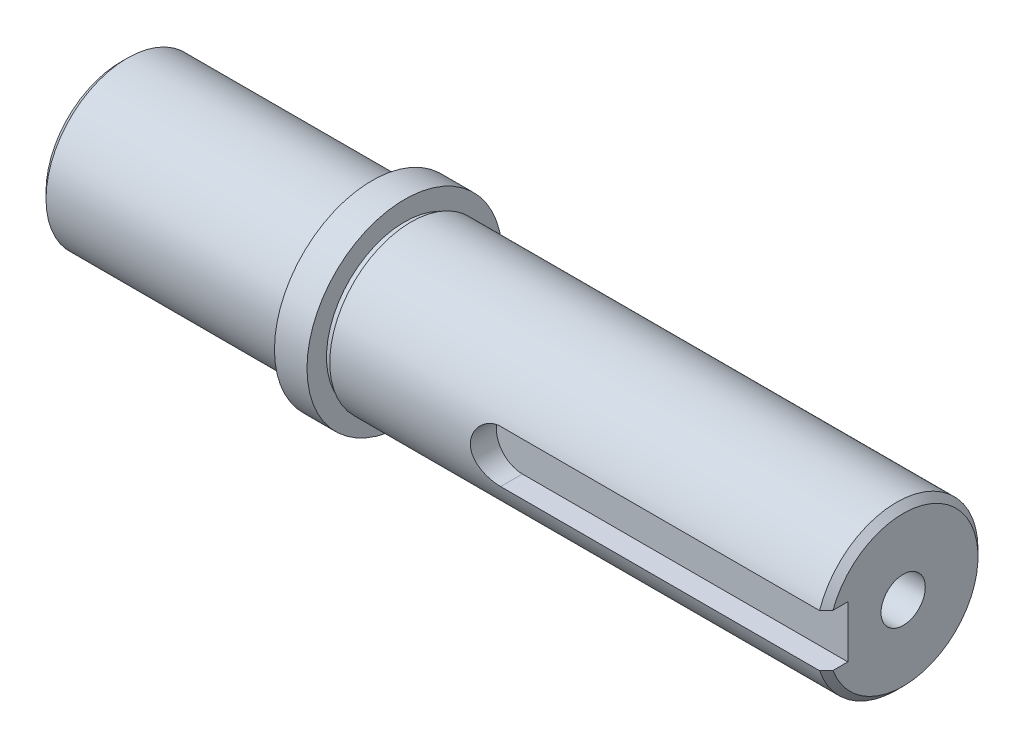
ISO-10303-21;
HEADER;
FILE_DESCRIPTION(('STEP AP214'),'2;1');
FILE_NAME('part.step','',(''),(''),'','','');
FILE_SCHEMA(('AUTOMOTIVE_DESIGN { 1 0 10303 214 1 1 1 1 }'));
ENDSEC;
DATA;
#1=APPLICATION_CONTEXT('core data for automotive mechanical design processes');
#2=APPLICATION_PROTOCOL_DEFINITION('international standard','automotive_design',2000,#1);
#3=PRODUCT_CONTEXT('',#1,'mechanical');
#4=PRODUCT('Part','Part','',(#3));
#5=PRODUCT_RELATED_PRODUCT_CATEGORY('part','',(#4));
#6=PRODUCT_DEFINITION_FORMATION('','',#4);
#7=PRODUCT_DEFINITION_CONTEXT('part definition',#1,'design');
#8=PRODUCT_DEFINITION('design','',#6,#7);
#9=PRODUCT_DEFINITION_SHAPE('','',#8);
#10=(LENGTH_UNIT() NAMED_UNIT(*) SI_UNIT(.MILLI.,.METRE.));
#11=(NAMED_UNIT(*) PLANE_ANGLE_UNIT() SI_UNIT($,.RADIAN.));
#12=(NAMED_UNIT(*) SI_UNIT($,.STERADIAN.) SOLID_ANGLE_UNIT());
#13=UNCERTAINTY_MEASURE_WITH_UNIT(LENGTH_MEASURE(1.E-05),#10,'distance_accuracy_value','');
#14=(GEOMETRIC_REPRESENTATION_CONTEXT(3) GLOBAL_UNCERTAINTY_ASSIGNED_CONTEXT((#13)) GLOBAL_UNIT_ASSIGNED_CONTEXT((#10,
#11,#12)) REPRESENTATION_CONTEXT('',''));
#15=CARTESIAN_POINT('',(0.,0.,0.));
#16=DIRECTION('',(0.,0.,1.));
#17=DIRECTION('',(1.,0.,0.));
#18=AXIS2_PLACEMENT_3D('',#15,#16,#17);
#19=CARTESIAN_POINT('',(0.,0.,0.));
#20=DIRECTION('',(1.,0.,0.));
#21=DIRECTION('',(0.,0.,-1.));
#22=AXIS2_PLACEMENT_3D('',#19,#20,#21);
#23=CYLINDRICAL_SURFACE('',#22,12.5);
#24=CARTESIAN_POINT('',(44.6,0.,0.));
#25=DIRECTION('',(1.,0.,0.));
#26=DIRECTION('',(0.,0.,-1.));
#27=AXIS2_PLACEMENT_3D('',#24,#25,#26);
#28=CIRCLE('',#27,12.5);
#29=CARTESIAN_POINT('',(44.6,0.,-12.5));
#30=VERTEX_POINT('',#29);
#31=EDGE_CURVE('E124',#30,#30,#28,.T.);
#32=ORIENTED_EDGE('',*,*,#31,.T.);
#33=EDGE_LOOP('',(#32));
#34=FACE_BOUND('',#33,.T.);
#35=DIRECTION('',(1.,0.,0.));
#36=VECTOR('',#35,1.);
#37=CARTESIAN_POINT('',(0.,4.00000000000004,11.842719282327));
#38=LINE('',#37,#36);
#39=CARTESIAN_POINT('',(70.2,4.00000000000004,11.842719282327));
#40=VERTEX_POINT('',#39);
#41=CARTESIAN_POINT('',(119.2,4.00000000000004,11.842719282327));
#42=VERTEX_POINT('',#41);
#43=EDGE_CURVE('E156',#40,#42,#38,.T.);
#44=ORIENTED_EDGE('',*,*,#43,.T.);
#45=CARTESIAN_POINT('',(119.2,0.,0.));
#46=DIRECTION('',(1.,0.,0.));
#47=DIRECTION('',(0.,0.,-1.));
#48=AXIS2_PLACEMENT_3D('',#45,#46,#47);
#49=CIRCLE('',#48,12.5);
#50=CARTESIAN_POINT('',(119.2,-3.99999999999996,11.842719282327));
#51=VERTEX_POINT('',#50);
#52=EDGE_CURVE('E51',#42,#51,#49,.F.);
#53=ORIENTED_EDGE('',*,*,#52,.T.);
#54=DIRECTION('',(1.,0.,0.));
#55=VECTOR('',#54,1.);
#56=CARTESIAN_POINT('',(0.,-3.99999999999996,11.842719282327));
#57=LINE('',#56,#55);
#58=CARTESIAN_POINT('',(70.2,-3.99999999999996,11.842719282327));
#59=VERTEX_POINT('',#58);
#60=EDGE_CURVE('E196',#51,#59,#57,.F.);
#61=ORIENTED_EDGE('',*,*,#60,.T.);
#62=CARTESIAN_POINT('',(70.2,-3.99999999999996,11.842719282327));
#63=CARTESIAN_POINT('',(70.0906002280384,-4.00001410484609,11.8427027366058));
#64=CARTESIAN_POINT('',(69.9812097901521,-3.99551217520096,11.8442348052368));
#65=CARTESIAN_POINT('',(69.7632717592635,-3.97758606678445,11.8502730910574));
#66=CARTESIAN_POINT('',(69.6547239615155,-3.96416412872567,11.8547785613244));
#67=CARTESIAN_POINT('',(69.4395389691545,-3.92855725119425,11.8666242076309));
#68=CARTESIAN_POINT('',(69.3328973043888,-3.90639676021446,11.8739564736692));
#69=CARTESIAN_POINT('',(69.1219943616284,-3.85353581488653,11.8912164993788));
#70=CARTESIAN_POINT('',(69.0177331598432,-3.82283508754052,11.9011443420201));
#71=CARTESIAN_POINT('',(68.7096949957216,-3.71831764495508,11.9343840843196));
#72=CARTESIAN_POINT('',(68.5103634479319,-3.63203544139883,11.9611699822066));
#73=CARTESIAN_POINT('',(68.1289874429581,-3.42895021192283,12.0209583955878));
#74=CARTESIAN_POINT('',(67.9469526209503,-3.31213030924905,12.0539643457894));
#75=CARTESIAN_POINT('',(67.5987460114008,-3.04678507884786,12.123798407807));
#76=CARTESIAN_POINT('',(67.4332816756605,-2.8973530389651,12.1607158548651));
#77=CARTESIAN_POINT('',(67.1292851514111,-2.57296449846112,12.2334561140966));
#78=CARTESIAN_POINT('',(66.9907576516423,-2.39800356343229,12.2692787347869));
#79=CARTESIAN_POINT('',(66.7413848016295,-2.02237003010508,12.3368244653945));
#80=CARTESIAN_POINT('',(66.6312780435303,-1.82118394546973,12.3684294972003));
#81=CARTESIAN_POINT('',(66.4467505046506,-1.40197197350365,12.4229251649938));
#82=CARTESIAN_POINT('',(66.3723195262181,-1.18395091903577,12.4458182908278));
#83=CARTESIAN_POINT('',(66.2636411357495,-0.744713961063329,12.4796767811416));
#84=CARTESIAN_POINT('',(66.2281750666199,-0.52382792010112,12.4910030499338));
#85=CARTESIAN_POINT('',(66.1945672009583,-0.0789648151746017,12.5017287122873));
#86=CARTESIAN_POINT('',(66.1964172664751,0.145011564197679,12.5011307063103));
#87=CARTESIAN_POINT('',(66.2365988292713,0.581094974437728,12.4883236673358));
#88=CARTESIAN_POINT('',(66.2736077679788,0.793338226675273,12.4765355800409));
#89=CARTESIAN_POINT('',(66.3808805516063,1.20842320012724,12.443194578958));
#90=CARTESIAN_POINT('',(66.4511462074328,1.41126440871782,12.4216411334261));
#91=CARTESIAN_POINT('',(66.6237578422357,1.80478548808187,12.3706364987475));
#92=CARTESIAN_POINT('',(66.7264965198688,1.99528012693531,12.3410893067347));
#93=CARTESIAN_POINT('',(66.9608290490452,2.35673113106233,12.2771965403044));
#94=CARTESIAN_POINT('',(67.092430206403,2.52768253275754,12.2428497517892));
#95=CARTESIAN_POINT('',(67.3874465312915,2.85304511528225,12.1712409097156));
#96=CARTESIAN_POINT('',(67.5519967025921,3.00641313381741,12.1339170352569));
#97=CARTESIAN_POINT('',(67.9049719000853,3.28377291775705,12.0618172896256));
#98=CARTESIAN_POINT('',(68.0934042588321,3.40775562728569,12.0270422062065));
#99=CARTESIAN_POINT('',(68.3913712377486,3.56958208232611,11.9796198433081));
#100=CARTESIAN_POINT('',(68.4939990592415,3.61975674493769,11.9645161845072));
#101=CARTESIAN_POINT('',(68.7034047527517,3.7112307515626,11.9364591580623));
#102=CARTESIAN_POINT('',(68.8101808877864,3.75253376401038,11.9235049021446));
#103=CARTESIAN_POINT('',(69.0270133278916,3.82585831579183,11.9001802342949));
#104=CARTESIAN_POINT('',(69.1370659779731,3.85788979915533,11.889807055759));
#105=CARTESIAN_POINT('',(69.3596951569476,3.91241790563968,11.8719756673203));
#106=CARTESIAN_POINT('',(69.4722705037974,3.93491889994979,11.8645161211931));
#107=CARTESIAN_POINT('',(69.687239245861,3.96832908530807,11.8533815888388));
#108=CARTESIAN_POINT('',(69.7894674157946,3.98020384564824,11.8493925948395));
#109=CARTESIAN_POINT('',(69.9944610780333,3.99603937127685,11.8440568016292));
#110=CARTESIAN_POINT('',(70.0972256382805,4.00001099551567,11.8427063770563));
#111=CARTESIAN_POINT('',(70.2,4.00000000000004,11.842719282327));
#112=B_SPLINE_CURVE_WITH_KNOTS('',3,(#62,#63,#64,#65,#66,#67,#68,#69,#70,#71,#72,#73,#74,#75,
#76,#77,#78,#79,#80,#81,#82,#83,#84,#85,#86,#87,#88,#89,#90,#91,#92,#93,#94,#95,#96,#97,#98,#99,
#100,#101,#102,#103,#104,#105,#106,#107,#108,#109,#110,#111),.UNSPECIFIED.,.F.,.F.,(4,2,2,2,2,2,
2,2,2,2,2,2,2,2,2,2,2,2,2,2,2,2,2,2,4),(0.,0.328080176984097,0.656077971124936,
0.983164539368213,1.31026156448799,1.9635529398425,2.61720612481382,3.29209427898755,
3.96709980211696,4.65819584662373,5.34909422856992,6.01770820975085,6.68617638029993,
7.33045501553829,7.97476873730064,8.62719320105811,9.27978300073406,9.96076419384897,
10.6419549776068,10.9872862883783,11.3324745283028,11.6772911585126,12.0219494657669,
12.3305938648259,12.6388138912331),.UNSPECIFIED.);
#113=EDGE_CURVE('E148',#59,#40,#112,.T.);
#114=ORIENTED_EDGE('',*,*,#113,.T.);
#115=EDGE_LOOP('',(#44,#53,#61,#114));
#116=FACE_BOUND('',#115,.T.);
#117=ADVANCED_FACE('F38',(#34,#116),#23,.T.);
#118=CARTESIAN_POINT('',(120.2,12.5,0.));
#119=DIRECTION('',(1.,0.,0.));
#120=DIRECTION('',(0.,0.,-1.));
#121=AXIS2_PLACEMENT_3D('',#118,#119,#120);
#122=PLANE('',#121);
#123=CARTESIAN_POINT('',(120.2,0.,0.));
#124=DIRECTION('',(1.,0.,0.));
#125=DIRECTION('',(0.,0.,-1.));
#126=AXIS2_PLACEMENT_3D('',#123,#124,#125);
#127=CIRCLE('',#126,3.4);
#128=CARTESIAN_POINT('',(120.2,0.,-3.4));
#129=VERTEX_POINT('',#128);
#130=EDGE_CURVE('E100',#129,#129,#127,.T.);
#131=ORIENTED_EDGE('',*,*,#130,.F.);
#132=EDGE_LOOP('',(#131));
#133=FACE_BOUND('',#132,.T.);
#134=DIRECTION('',(0.,0.,1.));
#135=VECTOR('',#134,1.);
#136=CARTESIAN_POINT('',(120.2,-4.,0.));
#137=LINE('',#136,#135);
#138=CARTESIAN_POINT('',(120.2,-3.99999999999997,8.50000000000001));
#139=VERTEX_POINT('',#138);
#140=CARTESIAN_POINT('',(120.2,-3.99999999999996,10.7819293264239));
#141=VERTEX_POINT('',#140);
#142=EDGE_CURVE('E99',#139,#141,#137,.T.);
#143=ORIENTED_EDGE('',*,*,#142,.T.);
#144=CARTESIAN_POINT('',(120.2,0.,0.));
#145=DIRECTION('',(1.,0.,0.));
#146=DIRECTION('',(0.,0.,-1.));
#147=AXIS2_PLACEMENT_3D('',#144,#145,#146);
#148=CIRCLE('',#147,11.5);
#149=CARTESIAN_POINT('',(120.2,4.00000000000004,10.7819293264239));
#150=VERTEX_POINT('',#149);
#151=EDGE_CURVE('E192',#141,#150,#148,.T.);
#152=ORIENTED_EDGE('',*,*,#151,.T.);
#153=DIRECTION('',(0.,0.,1.));
#154=VECTOR('',#153,1.);
#155=CARTESIAN_POINT('',(120.2,4.,0.));
#156=LINE('',#155,#154);
#157=CARTESIAN_POINT('',(120.2,4.00000000000003,8.49999999999999));
#158=VERTEX_POINT('',#157);
#159=EDGE_CURVE('E110',#158,#150,#156,.T.);
#160=ORIENTED_EDGE('',*,*,#159,.F.);
#161=DIRECTION('',(0.,-1.,0.));
#162=VECTOR('',#161,1.);
#163=CARTESIAN_POINT('',(120.2,0.,8.5));
#164=LINE('',#163,#162);
#165=EDGE_CURVE('E103',#158,#139,#164,.T.);
#166=ORIENTED_EDGE('',*,*,#165,.T.);
#167=EDGE_LOOP('',(#143,#152,#160,#166));
#168=FACE_BOUND('',#167,.T.);
#169=ADVANCED_FACE('F174',(#133,#168),#122,.T.);
#170=CARTESIAN_POINT('',(0.,0.,0.));
#171=DIRECTION('',(-1.,0.,0.));
#172=DIRECTION('',(0.,0.,1.));
#173=AXIS2_PLACEMENT_3D('',#170,#171,#172);
#174=PLANE('',#173);
#175=CARTESIAN_POINT('',(0.,0.,0.));
#176=DIRECTION('',(-1.,0.,0.));
#177=DIRECTION('',(0.,0.,1.));
#178=AXIS2_PLACEMENT_3D('',#175,#176,#177);
#179=CIRCLE('',#178,11.5);
#180=CARTESIAN_POINT('',(0.,0.,11.5));
#181=VERTEX_POINT('',#180);
#182=EDGE_CURVE('E145',#181,#181,#179,.T.);
#183=ORIENTED_EDGE('',*,*,#182,.T.);
#184=EDGE_LOOP('',(#183));
#185=FACE_BOUND('',#184,.T.);
#186=ADVANCED_FACE('F176',(#185),#174,.T.);
#187=CARTESIAN_POINT('',(0.,0.,0.));
#188=DIRECTION('',(1.,0.,0.));
#189=DIRECTION('',(0.,0.,-1.));
#190=AXIS2_PLACEMENT_3D('',#187,#188,#189);
#191=CYLINDRICAL_SURFACE('',#190,12.5);
#192=CARTESIAN_POINT('',(1.00000000000002,0.,0.));
#193=DIRECTION('',(-1.,0.,0.));
#194=DIRECTION('',(0.,0.,1.));
#195=AXIS2_PLACEMENT_3D('',#192,#193,#194);
#196=CIRCLE('',#195,12.5);
#197=CARTESIAN_POINT('',(1.00000000000002,0.,12.5));
#198=VERTEX_POINT('',#197);
#199=EDGE_CURVE('E142',#198,#198,#196,.F.);
#200=ORIENTED_EDGE('',*,*,#199,.T.);
#201=EDGE_LOOP('',(#200));
#202=FACE_BOUND('',#201,.T.);
#203=CARTESIAN_POINT('',(38.6,0.,0.));
#204=DIRECTION('',(1.,0.,0.));
#205=DIRECTION('',(0.,0.,-1.));
#206=AXIS2_PLACEMENT_3D('',#203,#204,#205);
#207=CIRCLE('',#206,12.5);
#208=CARTESIAN_POINT('',(38.6,0.,-12.5));
#209=VERTEX_POINT('',#208);
#210=EDGE_CURVE('E139',#209,#209,#207,.T.);
#211=ORIENTED_EDGE('',*,*,#210,.F.);
#212=EDGE_LOOP('',(#211));
#213=FACE_BOUND('',#212,.T.);
#214=ADVANCED_FACE('F182',(#202,#213),#191,.T.);
#215=CARTESIAN_POINT('',(38.6,12.5,0.));
#216=DIRECTION('',(-1.,0.,0.));
#217=DIRECTION('',(0.,0.,1.));
#218=AXIS2_PLACEMENT_3D('',#215,#216,#217);
#219=PLANE('',#218);
#220=ORIENTED_EDGE('',*,*,#210,.T.);
#221=EDGE_LOOP('',(#220));
#222=FACE_BOUND('',#221,.T.);
#223=CARTESIAN_POINT('',(38.6,0.,0.));
#224=DIRECTION('',(1.,0.,0.));
#225=DIRECTION('',(0.,0.,-1.));
#226=AXIS2_PLACEMENT_3D('',#223,#224,#225);
#227=CIRCLE('',#226,15.);
#228=CARTESIAN_POINT('',(38.6,0.,-15.));
#229=VERTEX_POINT('',#228);
#230=EDGE_CURVE('E136',#229,#229,#227,.T.);
#231=ORIENTED_EDGE('',*,*,#230,.F.);
#232=EDGE_LOOP('',(#231));
#233=FACE_BOUND('',#232,.T.);
#234=ADVANCED_FACE('F293',(#222,#233),#219,.T.);
#235=CARTESIAN_POINT('',(0.,0.,0.));
#236=DIRECTION('',(1.,0.,0.));
#237=DIRECTION('',(0.,0.,-1.));
#238=AXIS2_PLACEMENT_3D('',#235,#236,#237);
#239=CYLINDRICAL_SURFACE('',#238,15.);
#240=ORIENTED_EDGE('',*,*,#230,.T.);
#241=EDGE_LOOP('',(#240));
#242=FACE_BOUND('',#241,.T.);
#243=CARTESIAN_POINT('',(43.6,0.,0.));
#244=DIRECTION('',(1.,0.,0.));
#245=DIRECTION('',(0.,0.,-1.));
#246=AXIS2_PLACEMENT_3D('',#243,#244,#245);
#247=CIRCLE('',#246,15.);
#248=CARTESIAN_POINT('',(43.6,0.,-15.));
#249=VERTEX_POINT('',#248);
#250=EDGE_CURVE('E133',#249,#249,#247,.T.);
#251=ORIENTED_EDGE('',*,*,#250,.F.);
#252=EDGE_LOOP('',(#251));
#253=FACE_BOUND('',#252,.T.);
#254=ADVANCED_FACE('F328',(#242,#253),#239,.T.);
#255=CARTESIAN_POINT('',(43.6,15.,0.));
#256=DIRECTION('',(1.,0.,0.));
#257=DIRECTION('',(0.,0.,-1.));
#258=AXIS2_PLACEMENT_3D('',#255,#256,#257);
#259=PLANE('',#258);
#260=ORIENTED_EDGE('',*,*,#250,.T.);
#261=EDGE_LOOP('',(#260));
#262=FACE_BOUND('',#261,.T.);
#263=CARTESIAN_POINT('',(43.6,0.,0.));
#264=DIRECTION('',(1.,0.,0.));
#265=DIRECTION('',(0.,0.,-1.));
#266=AXIS2_PLACEMENT_3D('',#263,#264,#265);
#267=CIRCLE('',#266,12.);
#268=CARTESIAN_POINT('',(43.6,0.,-12.));
#269=VERTEX_POINT('',#268);
#270=EDGE_CURVE('E130',#269,#269,#267,.T.);
#271=ORIENTED_EDGE('',*,*,#270,.F.);
#272=EDGE_LOOP('',(#271));
#273=FACE_BOUND('',#272,.T.);
#274=ADVANCED_FACE('F318',(#262,#273),#259,.T.);
#275=CARTESIAN_POINT('',(0.,0.,0.));
#276=DIRECTION('',(1.,0.,0.));
#277=DIRECTION('',(0.,0.,-1.));
#278=AXIS2_PLACEMENT_3D('',#275,#276,#277);
#279=CYLINDRICAL_SURFACE('',#278,12.);
#280=ORIENTED_EDGE('',*,*,#270,.T.);
#281=EDGE_LOOP('',(#280));
#282=FACE_BOUND('',#281,.T.);
#283=CARTESIAN_POINT('',(44.6,0.,0.));
#284=DIRECTION('',(1.,0.,0.));
#285=DIRECTION('',(0.,0.,-1.));
#286=AXIS2_PLACEMENT_3D('',#283,#284,#285);
#287=CIRCLE('',#286,12.);
#288=CARTESIAN_POINT('',(44.6,0.,-12.));
#289=VERTEX_POINT('',#288);
#290=EDGE_CURVE('E127',#289,#289,#287,.T.);
#291=ORIENTED_EDGE('',*,*,#290,.F.);
#292=EDGE_LOOP('',(#291));
#293=FACE_BOUND('',#292,.T.);
#294=ADVANCED_FACE('F309',(#282,#293),#279,.T.);
#295=CARTESIAN_POINT('',(44.6,12.,0.));
#296=DIRECTION('',(-1.,0.,0.));
#297=DIRECTION('',(0.,0.,1.));
#298=AXIS2_PLACEMENT_3D('',#295,#296,#297);
#299=PLANE('',#298);
#300=ORIENTED_EDGE('',*,*,#290,.T.);
#301=EDGE_LOOP('',(#300));
#302=FACE_BOUND('',#301,.T.);
#303=ORIENTED_EDGE('',*,*,#31,.F.);
#304=EDGE_LOOP('',(#303));
#305=FACE_BOUND('',#304,.T.);
#306=ADVANCED_FACE('F282',(#302,#305),#299,.T.);
#307=CARTESIAN_POINT('',(1.00000000000002,0.,0.));
#308=DIRECTION('',(1.,0.,0.));
#309=DIRECTION('',(0.,0.,-1.));
#310=AXIS2_PLACEMENT_3D('',#307,#308,#309);
#311=CONICAL_SURFACE('',#310,12.5,0.785398163397449);
#312=ORIENTED_EDGE('',*,*,#182,.F.);
#313=EDGE_LOOP('',(#312));
#314=FACE_BOUND('',#313,.T.);
#315=ORIENTED_EDGE('',*,*,#199,.F.);
#316=EDGE_LOOP('',(#315));
#317=FACE_BOUND('',#316,.T.);
#318=ADVANCED_FACE('F172',(#314,#317),#311,.T.);
#319=CARTESIAN_POINT('',(115.2,-3.99999999999997,8.50000000000001));
#320=DIRECTION('',(0.,1.,0.));
#321=DIRECTION('',(0.,0.,1.));
#322=AXIS2_PLACEMENT_3D('',#319,#320,#321);
#323=PLANE('',#322);
#324=ORIENTED_EDGE('',*,*,#60,.F.);
#325=CARTESIAN_POINT('',(119.2,-3.99999999999996,11.842719282327));
#326=CARTESIAN_POINT('',(119.367127279734,-3.99999999999996,11.6663551969893));
#327=CARTESIAN_POINT('',(119.534024247058,-3.99999999999996,11.489773997595));
#328=CARTESIAN_POINT('',(119.867357580456,-3.99999999999996,11.1361773456887));
#329=CARTESIAN_POINT('',(120.033793946466,-3.99999999999996,10.9591618931153));
#330=CARTESIAN_POINT('',(120.2,-3.99999999999996,10.7819293264239));
#331=B_SPLINE_CURVE_WITH_KNOTS('',3,(#325,#326,#327,#328,#329,#330),.UNSPECIFIED.,.F.,.F.,(4,2,
4),(0.,0.728916771059856,1.45783364521109),.UNSPECIFIED.);
#332=EDGE_CURVE('E11',#51,#141,#331,.T.);
#333=ORIENTED_EDGE('',*,*,#332,.T.);
#334=ORIENTED_EDGE('',*,*,#142,.F.);
#335=DIRECTION('',(-1.,0.,0.));
#336=VECTOR('',#335,1.);
#337=CARTESIAN_POINT('',(115.2,-3.99999999999997,8.50000000000001));
#338=LINE('',#337,#336);
#339=CARTESIAN_POINT('',(70.2,-3.99999999999997,8.50000000000001));
#340=VERTEX_POINT('',#339);
#341=EDGE_CURVE('E112',#139,#340,#338,.T.);
#342=ORIENTED_EDGE('',*,*,#341,.T.);
#343=DIRECTION('',(0.,0.,1.));
#344=VECTOR('',#343,1.);
#345=CARTESIAN_POINT('',(70.2,-3.99999999999997,8.50000000000001));
#346=LINE('',#345,#344);
#347=EDGE_CURVE('E121',#340,#59,#346,.T.);
#348=ORIENTED_EDGE('',*,*,#347,.T.);
#349=EDGE_LOOP('',(#324,#333,#334,#342,#348));
#350=FACE_BOUND('',#349,.T.);
#351=ADVANCED_FACE('F166',(#350),#323,.T.);
#352=CARTESIAN_POINT('',(70.2,0.,8.5));
#353=DIRECTION('',(0.,0.,1.));
#354=DIRECTION('',(0.,-1.,0.));
#355=AXIS2_PLACEMENT_3D('',#352,#353,#354);
#356=CYLINDRICAL_SURFACE('',#355,4.);
#357=ORIENTED_EDGE('',*,*,#347,.F.);
#358=CARTESIAN_POINT('',(70.2,0.,8.5));
#359=DIRECTION('',(0.,0.,-1.));
#360=DIRECTION('',(0.,1.,0.));
#361=AXIS2_PLACEMENT_3D('',#358,#359,#360);
#362=CIRCLE('',#361,4.);
#363=CARTESIAN_POINT('',(70.2,4.00000000000003,8.49999999999999));
#364=VERTEX_POINT('',#363);
#365=EDGE_CURVE('E114',#340,#364,#362,.T.);
#366=ORIENTED_EDGE('',*,*,#365,.T.);
#367=DIRECTION('',(0.,0.,1.));
#368=VECTOR('',#367,1.);
#369=CARTESIAN_POINT('',(70.2,4.00000000000003,8.49999999999999));
#370=LINE('',#369,#368);
#371=EDGE_CURVE('E118',#364,#40,#370,.T.);
#372=ORIENTED_EDGE('',*,*,#371,.T.);
#373=ORIENTED_EDGE('',*,*,#113,.F.);
#374=EDGE_LOOP('',(#357,#366,#372,#373));
#375=FACE_BOUND('',#374,.T.);
#376=ADVANCED_FACE('F161',(#375),#356,.F.);
#377=CARTESIAN_POINT('',(115.2,4.00000000000003,8.49999999999999));
#378=DIRECTION('',(0.,-1.,0.));
#379=DIRECTION('',(0.,0.,-1.));
#380=AXIS2_PLACEMENT_3D('',#377,#378,#379);
#381=PLANE('',#380);
#382=ORIENTED_EDGE('',*,*,#159,.T.);
#383=CARTESIAN_POINT('',(120.2,4.00000000000004,10.7819293264239));
#384=CARTESIAN_POINT('',(120.033793946466,4.00000000000004,10.9591618931152));
#385=CARTESIAN_POINT('',(119.867357580456,4.00000000000004,11.1361773456887));
#386=CARTESIAN_POINT('',(119.534024247058,4.00000000000004,11.489773997595));
#387=CARTESIAN_POINT('',(119.367127279734,4.00000000000004,11.6663551969892));
#388=CARTESIAN_POINT('',(119.2,4.00000000000004,11.842719282327));
#389=B_SPLINE_CURVE_WITH_KNOTS('',3,(#383,#384,#385,#386,#387,#388),.UNSPECIFIED.,.F.,.F.,(4,2,
4),(0.,0.728916874151231,1.45783364521109),.UNSPECIFIED.);
#390=EDGE_CURVE('E65',#150,#42,#389,.T.);
#391=ORIENTED_EDGE('',*,*,#390,.T.);
#392=ORIENTED_EDGE('',*,*,#43,.F.);
#393=ORIENTED_EDGE('',*,*,#371,.F.);
#394=DIRECTION('',(1.,0.,0.));
#395=VECTOR('',#394,1.);
#396=CARTESIAN_POINT('',(115.2,4.00000000000003,8.49999999999999));
#397=LINE('',#396,#395);
#398=EDGE_CURVE('E116',#364,#158,#397,.T.);
#399=ORIENTED_EDGE('',*,*,#398,.T.);
#400=EDGE_LOOP('',(#382,#391,#392,#393,#399));
#401=FACE_BOUND('',#400,.T.);
#402=ADVANCED_FACE('F165',(#401),#381,.T.);
#403=CARTESIAN_POINT('',(115.2,0.,8.5));
#404=DIRECTION('',(0.,0.,1.));
#405=DIRECTION('',(0.,-1.,0.));
#406=AXIS2_PLACEMENT_3D('',#403,#404,#405);
#407=PLANE('',#406);
#408=ORIENTED_EDGE('',*,*,#165,.F.);
#409=ORIENTED_EDGE('',*,*,#398,.F.);
#410=ORIENTED_EDGE('',*,*,#365,.F.);
#411=ORIENTED_EDGE('',*,*,#341,.F.);
#412=EDGE_LOOP('',(#408,#409,#410,#411));
#413=FACE_BOUND('',#412,.T.);
#414=ADVANCED_FACE('F93',(#413),#407,.T.);
#415=CARTESIAN_POINT('',(100.45,0.,0.));
#416=DIRECTION('',(1.,0.,0.));
#417=DIRECTION('',(0.,0.,-1.));
#418=AXIS2_PLACEMENT_3D('',#415,#416,#417);
#419=CONICAL_SURFACE('',#418,3.4,1.02974425867665);
#420=CARTESIAN_POINT('',(98.4070738953063,0.,0.));
#421=VERTEX_POINT('',#420);
#422=VERTEX_LOOP('',#421);
#423=FACE_BOUND('',#422,.T.);
#424=CARTESIAN_POINT('',(100.45,0.,0.));
#425=DIRECTION('',(1.,0.,0.));
#426=DIRECTION('',(0.,0.,-1.));
#427=AXIS2_PLACEMENT_3D('',#424,#425,#426);
#428=CIRCLE('',#427,3.4);
#429=CARTESIAN_POINT('',(100.45,0.,-3.4));
#430=VERTEX_POINT('',#429);
#431=EDGE_CURVE('E97',#430,#430,#428,.T.);
#432=ORIENTED_EDGE('',*,*,#431,.T.);
#433=EDGE_LOOP('',(#432));
#434=FACE_BOUND('',#433,.T.);
#435=ADVANCED_FACE('F89',(#423,#434),#419,.F.);
#436=CARTESIAN_POINT('',(120.2,0.,0.));
#437=DIRECTION('',(1.,0.,0.));
#438=DIRECTION('',(0.,0.,-1.));
#439=AXIS2_PLACEMENT_3D('',#436,#437,#438);
#440=CYLINDRICAL_SURFACE('',#439,3.4);
#441=ORIENTED_EDGE('',*,*,#431,.F.);
#442=EDGE_LOOP('',(#441));
#443=FACE_BOUND('',#442,.T.);
#444=ORIENTED_EDGE('',*,*,#130,.T.);
#445=EDGE_LOOP('',(#444));
#446=FACE_BOUND('',#445,.T.);
#447=ADVANCED_FACE('F92',(#443,#446),#440,.F.);
#448=CARTESIAN_POINT('',(120.2,0.,0.));
#449=DIRECTION('',(-1.,0.,0.));
#450=DIRECTION('',(0.,0.,1.));
#451=AXIS2_PLACEMENT_3D('',#448,#449,#450);
#452=CONICAL_SURFACE('',#451,11.5,0.78539816339745);
#453=ORIENTED_EDGE('',*,*,#332,.F.);
#454=ORIENTED_EDGE('',*,*,#52,.F.);
#455=ORIENTED_EDGE('',*,*,#390,.F.);
#456=ORIENTED_EDGE('',*,*,#151,.F.);
#457=EDGE_LOOP('',(#453,#454,#455,#456));
#458=FACE_BOUND('',#457,.T.);
#459=ADVANCED_FACE('F40',(#458),#452,.T.);
#460=CLOSED_SHELL('',(#117,#169,#186,#214,#234,#254,#274,#294,#306,#318,#351,#376,#402,#414,
#435,#447,#459));
#461=MANIFOLD_SOLID_BREP('B2',#460);
#462=ADVANCED_BREP_SHAPE_REPRESENTATION('',(#18,#461),#14);
#463=SHAPE_DEFINITION_REPRESENTATION(#9,#462);
ENDSEC;
END-ISO-10303-21;
